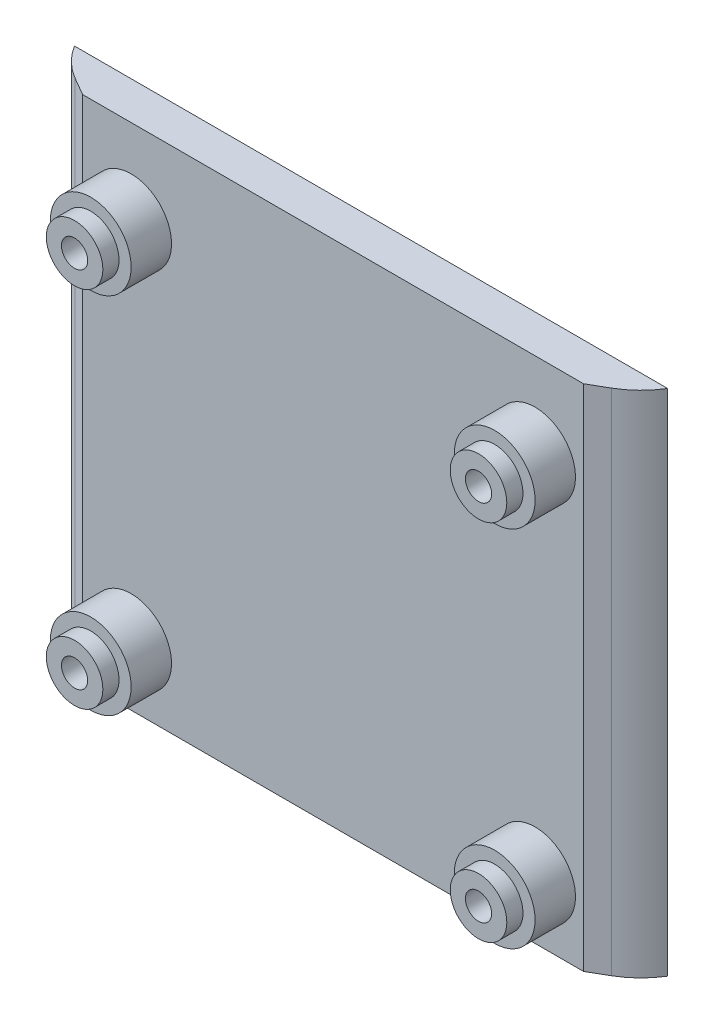
ISO-10303-21;
HEADER;
FILE_DESCRIPTION(('STEP AP214'),'2;1');
FILE_NAME('part.step','',(''),(''),'','','');
FILE_SCHEMA(('AUTOMOTIVE_DESIGN { 1 0 10303 214 1 1 1 1 }'));
ENDSEC;
DATA;
#1=APPLICATION_CONTEXT('core data for automotive mechanical design processes');
#2=APPLICATION_PROTOCOL_DEFINITION('international standard','automotive_design',2000,#1);
#3=PRODUCT_CONTEXT('',#1,'mechanical');
#4=PRODUCT('Part','Part','',(#3));
#5=PRODUCT_RELATED_PRODUCT_CATEGORY('part','',(#4));
#6=PRODUCT_DEFINITION_FORMATION('','',#4);
#7=PRODUCT_DEFINITION_CONTEXT('part definition',#1,'design');
#8=PRODUCT_DEFINITION('design','',#6,#7);
#9=PRODUCT_DEFINITION_SHAPE('','',#8);
#10=(LENGTH_UNIT() NAMED_UNIT(*) SI_UNIT(.MILLI.,.METRE.));
#11=(NAMED_UNIT(*) PLANE_ANGLE_UNIT() SI_UNIT($,.RADIAN.));
#12=(NAMED_UNIT(*) SI_UNIT($,.STERADIAN.) SOLID_ANGLE_UNIT());
#13=UNCERTAINTY_MEASURE_WITH_UNIT(LENGTH_MEASURE(1.E-05),#10,'distance_accuracy_value','');
#14=(GEOMETRIC_REPRESENTATION_CONTEXT(3) GLOBAL_UNCERTAINTY_ASSIGNED_CONTEXT((#13)) GLOBAL_UNIT_ASSIGNED_CONTEXT((#10,
#11,#12)) REPRESENTATION_CONTEXT('',''));
#15=CARTESIAN_POINT('',(0.,0.,0.));
#16=DIRECTION('',(0.,0.,1.));
#17=DIRECTION('',(1.,0.,0.));
#18=AXIS2_PLACEMENT_3D('',#15,#16,#17);
#19=CARTESIAN_POINT('',(0.,0.,10.));
#20=DIRECTION('',(0.,1.,0.));
#21=DIRECTION('',(0.,0.,1.));
#22=AXIS2_PLACEMENT_3D('',#19,#20,#21);
#23=PLANE('',#22);
#24=CARTESIAN_POINT('',(2.81284282483099,0.,0.0769901783117602));
#25=DIRECTION('',(0.,1.,0.));
#26=DIRECTION('',(0.,0.,1.));
#27=AXIS2_PLACEMENT_3D('',#24,#25,#26);
#28=CIRCLE('',#27,10.);
#29=CARTESIAN_POINT('',(-2.18715717516904,0.,8.73724421615612));
#30=VERTEX_POINT('',#29);
#31=CARTESIAN_POINT('',(-5.71305020118273,0.,5.30280572317846));
#32=VERTEX_POINT('',#31);
#33=EDGE_CURVE('E113',#30,#32,#28,.F.);
#34=ORIENTED_EDGE('',*,*,#33,.T.);
#35=DIRECTION('',(1.,0.,0.));
#36=VECTOR('',#35,1.);
#37=CARTESIAN_POINT('',(82.2171151192355,0.,5.30280572317846));
#38=LINE('',#37,#36);
#39=CARTESIAN_POINT('',(67.7130502011828,0.,5.30280572317846));
#40=VERTEX_POINT('',#39);
#41=EDGE_CURVE('E88',#32,#40,#38,.T.);
#42=ORIENTED_EDGE('',*,*,#41,.T.);
#43=CARTESIAN_POINT('',(59.187157175169,0.,0.0769901783117602));
#44=DIRECTION('',(0.,1.,0.));
#45=DIRECTION('',(0.,0.,1.));
#46=AXIS2_PLACEMENT_3D('',#43,#44,#45);
#47=CIRCLE('',#46,10.);
#48=CARTESIAN_POINT('',(64.187157175169,0.,8.73724421615611));
#49=VERTEX_POINT('',#48);
#50=EDGE_CURVE('E56',#40,#49,#47,.F.);
#51=ORIENTED_EDGE('',*,*,#50,.T.);
#52=DIRECTION('',(-0.866025403784436,0.,0.500000000000004));
#53=VECTOR('',#52,1.);
#54=CARTESIAN_POINT('',(62.,0.,10.));
#55=LINE('',#54,#53);
#56=CARTESIAN_POINT('',(62.,0.,10.));
#57=VERTEX_POINT('',#56);
#58=EDGE_CURVE('E121',#49,#57,#55,.T.);
#59=ORIENTED_EDGE('',*,*,#58,.T.);
#60=DIRECTION('',(1.,0.,0.));
#61=VECTOR('',#60,1.);
#62=CARTESIAN_POINT('',(0.,0.,10.));
#63=LINE('',#62,#61);
#64=CARTESIAN_POINT('',(0.,0.,10.));
#65=VERTEX_POINT('',#64);
#66=EDGE_CURVE('E189',#65,#57,#63,.T.);
#67=ORIENTED_EDGE('',*,*,#66,.F.);
#68=DIRECTION('',(0.866025403784436,0.,0.500000000000004));
#69=VECTOR('',#68,1.);
#70=CARTESIAN_POINT('',(0.,0.,10.));
#71=LINE('',#70,#69);
#72=EDGE_CURVE('E134',#30,#65,#71,.T.);
#73=ORIENTED_EDGE('',*,*,#72,.F.);
#74=EDGE_LOOP('',(#34,#42,#51,#59,#67,#73));
#75=FACE_BOUND('',#74,.T.);
#76=ADVANCED_FACE('F34',(#75),#23,.F.);
#77=CARTESIAN_POINT('',(0.,0.,10.));
#78=DIRECTION('',(0.,0.,-1.));
#79=DIRECTION('',(-1.,0.,0.));
#80=AXIS2_PLACEMENT_3D('',#77,#78,#79);
#81=PLANE('',#80);
#82=CARTESIAN_POINT('',(6.,52.5,10.));
#83=DIRECTION('',(0.,0.,-1.));
#84=DIRECTION('',(-1.,0.,0.));
#85=AXIS2_PLACEMENT_3D('',#82,#83,#84);
#86=CIRCLE('',#85,5.);
#87=CARTESIAN_POINT('',(1.,52.5,10.));
#88=VERTEX_POINT('',#87);
#89=EDGE_CURVE('E194',#88,#88,#86,.F.);
#90=ORIENTED_EDGE('',*,*,#89,.F.);
#91=EDGE_LOOP('',(#90));
#92=FACE_BOUND('',#91,.T.);
#93=CARTESIAN_POINT('',(56.,52.5,10.));
#94=DIRECTION('',(0.,0.,-1.));
#95=DIRECTION('',(-1.,0.,0.));
#96=AXIS2_PLACEMENT_3D('',#93,#94,#95);
#97=CIRCLE('',#96,5.);
#98=CARTESIAN_POINT('',(51.,52.5,10.));
#99=VERTEX_POINT('',#98);
#100=EDGE_CURVE('E108',#99,#99,#97,.F.);
#101=ORIENTED_EDGE('',*,*,#100,.F.);
#102=EDGE_LOOP('',(#101));
#103=FACE_BOUND('',#102,.T.);
#104=DIRECTION('',(0.,-1.,0.));
#105=VECTOR('',#104,1.);
#106=CARTESIAN_POINT('',(0.,0.,10.));
#107=LINE('',#106,#105);
#108=CARTESIAN_POINT('',(0.,63.,10.));
#109=VERTEX_POINT('',#108);
#110=EDGE_CURVE('E186',#109,#65,#107,.T.);
#111=ORIENTED_EDGE('',*,*,#110,.T.);
#112=ORIENTED_EDGE('',*,*,#66,.T.);
#113=DIRECTION('',(0.,1.,0.));
#114=VECTOR('',#113,1.);
#115=CARTESIAN_POINT('',(62.,0.,10.));
#116=LINE('',#115,#114);
#117=CARTESIAN_POINT('',(62.,63.,10.));
#118=VERTEX_POINT('',#117);
#119=EDGE_CURVE('E192',#57,#118,#116,.T.);
#120=ORIENTED_EDGE('',*,*,#119,.T.);
#121=DIRECTION('',(1.,0.,0.));
#122=VECTOR('',#121,1.);
#123=CARTESIAN_POINT('',(0.,63.,10.));
#124=LINE('',#123,#122);
#125=EDGE_CURVE('E125',#109,#118,#124,.T.);
#126=ORIENTED_EDGE('',*,*,#125,.F.);
#127=EDGE_LOOP('',(#111,#112,#120,#126));
#128=FACE_BOUND('',#127,.T.);
#129=CARTESIAN_POINT('',(56.,7.5,10.));
#130=DIRECTION('',(0.,0.,-1.));
#131=DIRECTION('',(-1.,0.,0.));
#132=AXIS2_PLACEMENT_3D('',#129,#130,#131);
#133=CIRCLE('',#132,5.);
#134=CARTESIAN_POINT('',(51.,7.5,10.));
#135=VERTEX_POINT('',#134);
#136=EDGE_CURVE('E197',#135,#135,#133,.F.);
#137=ORIENTED_EDGE('',*,*,#136,.F.);
#138=EDGE_LOOP('',(#137));
#139=FACE_BOUND('',#138,.T.);
#140=CARTESIAN_POINT('',(6.,7.49999999999999,10.));
#141=DIRECTION('',(0.,0.,-1.));
#142=DIRECTION('',(-1.,0.,0.));
#143=AXIS2_PLACEMENT_3D('',#140,#141,#142);
#144=CIRCLE('',#143,5.);
#145=CARTESIAN_POINT('',(0.999999999999997,7.49999999999999,10.));
#146=VERTEX_POINT('',#145);
#147=EDGE_CURVE('E200',#146,#146,#144,.F.);
#148=ORIENTED_EDGE('',*,*,#147,.F.);
#149=EDGE_LOOP('',(#148));
#150=FACE_BOUND('',#149,.T.);
#151=ADVANCED_FACE('F207',(#92,#103,#128,#139,#150),#81,.F.);
#152=CARTESIAN_POINT('',(6.,52.5,15.));
#153=DIRECTION('',(0.,0.,-1.));
#154=DIRECTION('',(-1.,0.,0.));
#155=AXIS2_PLACEMENT_3D('',#152,#153,#154);
#156=CYLINDRICAL_SURFACE('',#155,5.);
#157=CARTESIAN_POINT('',(6.,52.5,15.));
#158=DIRECTION('',(0.,0.,1.));
#159=DIRECTION('',(1.,0.,0.));
#160=AXIS2_PLACEMENT_3D('',#157,#158,#159);
#161=CIRCLE('',#160,5.);
#162=CARTESIAN_POINT('',(11.,52.5,15.));
#163=VERTEX_POINT('',#162);
#164=EDGE_CURVE('E183',#163,#163,#161,.T.);
#165=ORIENTED_EDGE('',*,*,#164,.F.);
#166=EDGE_LOOP('',(#165));
#167=FACE_BOUND('',#166,.T.);
#168=ORIENTED_EDGE('',*,*,#89,.T.);
#169=EDGE_LOOP('',(#168));
#170=FACE_BOUND('',#169,.T.);
#171=ADVANCED_FACE('F210',(#167,#170),#156,.T.);
#172=CARTESIAN_POINT('',(6.,52.5,15.));
#173=DIRECTION('',(0.,0.,1.));
#174=DIRECTION('',(1.,0.,0.));
#175=AXIS2_PLACEMENT_3D('',#172,#173,#174);
#176=PLANE('',#175);
#177=CARTESIAN_POINT('',(6.,52.5,15.));
#178=DIRECTION('',(0.,0.,1.));
#179=DIRECTION('',(1.,0.,0.));
#180=AXIS2_PLACEMENT_3D('',#177,#178,#179);
#181=CIRCLE('',#180,3.5);
#182=CARTESIAN_POINT('',(9.5,52.5,15.));
#183=VERTEX_POINT('',#182);
#184=EDGE_CURVE('E166',#183,#183,#181,.T.);
#185=ORIENTED_EDGE('',*,*,#184,.F.);
#186=EDGE_LOOP('',(#185));
#187=FACE_BOUND('',#186,.T.);
#188=ORIENTED_EDGE('',*,*,#164,.T.);
#189=EDGE_LOOP('',(#188));
#190=FACE_BOUND('',#189,.T.);
#191=ADVANCED_FACE('F446',(#187,#190),#176,.T.);
#192=CARTESIAN_POINT('',(56.,7.5,15.));
#193=DIRECTION('',(0.,0.,-1.));
#194=DIRECTION('',(-1.,0.,0.));
#195=AXIS2_PLACEMENT_3D('',#192,#193,#194);
#196=CYLINDRICAL_SURFACE('',#195,5.);
#197=CARTESIAN_POINT('',(56.,7.5,15.));
#198=DIRECTION('',(0.,0.,1.));
#199=DIRECTION('',(1.,0.,0.));
#200=AXIS2_PLACEMENT_3D('',#197,#198,#199);
#201=CIRCLE('',#200,5.);
#202=CARTESIAN_POINT('',(61.,7.5,15.));
#203=VERTEX_POINT('',#202);
#204=EDGE_CURVE('E180',#203,#203,#201,.T.);
#205=ORIENTED_EDGE('',*,*,#204,.F.);
#206=EDGE_LOOP('',(#205));
#207=FACE_BOUND('',#206,.T.);
#208=ORIENTED_EDGE('',*,*,#136,.T.);
#209=EDGE_LOOP('',(#208));
#210=FACE_BOUND('',#209,.T.);
#211=ADVANCED_FACE('F232',(#207,#210),#196,.T.);
#212=CARTESIAN_POINT('',(56.,7.5,15.));
#213=DIRECTION('',(0.,0.,1.));
#214=DIRECTION('',(1.,0.,0.));
#215=AXIS2_PLACEMENT_3D('',#212,#213,#214);
#216=PLANE('',#215);
#217=CARTESIAN_POINT('',(56.,7.5,15.));
#218=DIRECTION('',(0.,0.,1.));
#219=DIRECTION('',(1.,0.,0.));
#220=AXIS2_PLACEMENT_3D('',#217,#218,#219);
#221=CIRCLE('',#220,3.5);
#222=CARTESIAN_POINT('',(59.5,7.5,15.));
#223=VERTEX_POINT('',#222);
#224=EDGE_CURVE('E154',#223,#223,#221,.T.);
#225=ORIENTED_EDGE('',*,*,#224,.F.);
#226=EDGE_LOOP('',(#225));
#227=FACE_BOUND('',#226,.T.);
#228=ORIENTED_EDGE('',*,*,#204,.T.);
#229=EDGE_LOOP('',(#228));
#230=FACE_BOUND('',#229,.T.);
#231=ADVANCED_FACE('F223',(#227,#230),#216,.T.);
#232=CARTESIAN_POINT('',(6.,7.49999999999999,15.));
#233=DIRECTION('',(0.,0.,-1.));
#234=DIRECTION('',(-1.,0.,0.));
#235=AXIS2_PLACEMENT_3D('',#232,#233,#234);
#236=CYLINDRICAL_SURFACE('',#235,5.);
#237=CARTESIAN_POINT('',(6.,7.49999999999999,15.));
#238=DIRECTION('',(0.,0.,1.));
#239=DIRECTION('',(1.,0.,0.));
#240=AXIS2_PLACEMENT_3D('',#237,#238,#239);
#241=CIRCLE('',#240,5.);
#242=CARTESIAN_POINT('',(11.,7.49999999999999,15.));
#243=VERTEX_POINT('',#242);
#244=EDGE_CURVE('E177',#243,#243,#241,.T.);
#245=ORIENTED_EDGE('',*,*,#244,.F.);
#246=EDGE_LOOP('',(#245));
#247=FACE_BOUND('',#246,.T.);
#248=ORIENTED_EDGE('',*,*,#147,.T.);
#249=EDGE_LOOP('',(#248));
#250=FACE_BOUND('',#249,.T.);
#251=ADVANCED_FACE('F220',(#247,#250),#236,.T.);
#252=CARTESIAN_POINT('',(6.,7.49999999999999,15.));
#253=DIRECTION('',(0.,0.,1.));
#254=DIRECTION('',(1.,0.,0.));
#255=AXIS2_PLACEMENT_3D('',#252,#253,#254);
#256=PLANE('',#255);
#257=CARTESIAN_POINT('',(6.,7.49999999999999,15.));
#258=DIRECTION('',(0.,0.,1.));
#259=DIRECTION('',(1.,0.,0.));
#260=AXIS2_PLACEMENT_3D('',#257,#258,#259);
#261=CIRCLE('',#260,3.5);
#262=CARTESIAN_POINT('',(9.5,7.49999999999999,15.));
#263=VERTEX_POINT('',#262);
#264=EDGE_CURVE('E150',#263,#263,#261,.T.);
#265=ORIENTED_EDGE('',*,*,#264,.F.);
#266=EDGE_LOOP('',(#265));
#267=FACE_BOUND('',#266,.T.);
#268=ORIENTED_EDGE('',*,*,#244,.T.);
#269=EDGE_LOOP('',(#268));
#270=FACE_BOUND('',#269,.T.);
#271=ADVANCED_FACE('F222',(#267,#270),#256,.T.);
#272=CARTESIAN_POINT('',(56.,52.5,15.));
#273=DIRECTION('',(0.,0.,-1.));
#274=DIRECTION('',(-1.,0.,0.));
#275=AXIS2_PLACEMENT_3D('',#272,#273,#274);
#276=CYLINDRICAL_SURFACE('',#275,5.);
#277=CARTESIAN_POINT('',(56.,52.5,15.));
#278=DIRECTION('',(0.,0.,1.));
#279=DIRECTION('',(1.,0.,0.));
#280=AXIS2_PLACEMENT_3D('',#277,#278,#279);
#281=CIRCLE('',#280,5.);
#282=CARTESIAN_POINT('',(61.,52.5,15.));
#283=VERTEX_POINT('',#282);
#284=EDGE_CURVE('E172',#283,#283,#281,.T.);
#285=ORIENTED_EDGE('',*,*,#284,.F.);
#286=EDGE_LOOP('',(#285));
#287=FACE_BOUND('',#286,.T.);
#288=ORIENTED_EDGE('',*,*,#100,.T.);
#289=EDGE_LOOP('',(#288));
#290=FACE_BOUND('',#289,.T.);
#291=ADVANCED_FACE('F205',(#287,#290),#276,.T.);
#292=CARTESIAN_POINT('',(56.,52.5,15.));
#293=DIRECTION('',(0.,0.,1.));
#294=DIRECTION('',(1.,0.,0.));
#295=AXIS2_PLACEMENT_3D('',#292,#293,#294);
#296=PLANE('',#295);
#297=CARTESIAN_POINT('',(56.,52.5,15.));
#298=DIRECTION('',(0.,0.,1.));
#299=DIRECTION('',(1.,0.,0.));
#300=AXIS2_PLACEMENT_3D('',#297,#298,#299);
#301=CIRCLE('',#300,3.5);
#302=CARTESIAN_POINT('',(59.5,52.5,15.));
#303=VERTEX_POINT('',#302);
#304=EDGE_CURVE('E160',#303,#303,#301,.T.);
#305=ORIENTED_EDGE('',*,*,#304,.F.);
#306=EDGE_LOOP('',(#305));
#307=FACE_BOUND('',#306,.T.);
#308=ORIENTED_EDGE('',*,*,#284,.T.);
#309=EDGE_LOOP('',(#308));
#310=FACE_BOUND('',#309,.T.);
#311=ADVANCED_FACE('F304',(#307,#310),#296,.T.);
#312=CARTESIAN_POINT('',(6.,52.5,17.));
#313=DIRECTION('',(0.,0.,-1.));
#314=DIRECTION('',(-1.,0.,0.));
#315=AXIS2_PLACEMENT_3D('',#312,#313,#314);
#316=CYLINDRICAL_SURFACE('',#315,3.5);
#317=CARTESIAN_POINT('',(6.,52.5,17.));
#318=DIRECTION('',(0.,0.,1.));
#319=DIRECTION('',(1.,0.,0.));
#320=AXIS2_PLACEMENT_3D('',#317,#318,#319);
#321=CIRCLE('',#320,3.5);
#322=CARTESIAN_POINT('',(9.5,52.5,17.));
#323=VERTEX_POINT('',#322);
#324=EDGE_CURVE('E169',#323,#323,#321,.T.);
#325=ORIENTED_EDGE('',*,*,#324,.F.);
#326=EDGE_LOOP('',(#325));
#327=FACE_BOUND('',#326,.T.);
#328=ORIENTED_EDGE('',*,*,#184,.T.);
#329=EDGE_LOOP('',(#328));
#330=FACE_BOUND('',#329,.T.);
#331=ADVANCED_FACE('F300',(#327,#330),#316,.T.);
#332=CARTESIAN_POINT('',(6.,52.5,17.));
#333=DIRECTION('',(0.,0.,1.));
#334=DIRECTION('',(1.,0.,0.));
#335=AXIS2_PLACEMENT_3D('',#332,#333,#334);
#336=PLANE('',#335);
#337=CARTESIAN_POINT('',(6.,52.5,17.));
#338=DIRECTION('',(0.,0.,1.));
#339=DIRECTION('',(1.,0.,0.));
#340=AXIS2_PLACEMENT_3D('',#337,#338,#339);
#341=CIRCLE('',#340,1.625);
#342=CARTESIAN_POINT('',(7.625,52.5,17.));
#343=VERTEX_POINT('',#342);
#344=EDGE_CURVE('E142',#343,#343,#341,.T.);
#345=ORIENTED_EDGE('',*,*,#344,.F.);
#346=EDGE_LOOP('',(#345));
#347=FACE_BOUND('',#346,.T.);
#348=ORIENTED_EDGE('',*,*,#324,.T.);
#349=EDGE_LOOP('',(#348));
#350=FACE_BOUND('',#349,.T.);
#351=ADVANCED_FACE('F296',(#347,#350),#336,.T.);
#352=CARTESIAN_POINT('',(56.,52.5,17.));
#353=DIRECTION('',(0.,0.,-1.));
#354=DIRECTION('',(-1.,0.,0.));
#355=AXIS2_PLACEMENT_3D('',#352,#353,#354);
#356=CYLINDRICAL_SURFACE('',#355,3.5);
#357=CARTESIAN_POINT('',(56.,52.5,17.));
#358=DIRECTION('',(0.,0.,1.));
#359=DIRECTION('',(1.,0.,0.));
#360=AXIS2_PLACEMENT_3D('',#357,#358,#359);
#361=CIRCLE('',#360,3.5);
#362=CARTESIAN_POINT('',(59.5,52.5,17.));
#363=VERTEX_POINT('',#362);
#364=EDGE_CURVE('E163',#363,#363,#361,.T.);
#365=ORIENTED_EDGE('',*,*,#364,.F.);
#366=EDGE_LOOP('',(#365));
#367=FACE_BOUND('',#366,.T.);
#368=ORIENTED_EDGE('',*,*,#304,.T.);
#369=EDGE_LOOP('',(#368));
#370=FACE_BOUND('',#369,.T.);
#371=ADVANCED_FACE('F292',(#367,#370),#356,.T.);
#372=CARTESIAN_POINT('',(56.,52.5,17.));
#373=DIRECTION('',(0.,0.,1.));
#374=DIRECTION('',(1.,0.,0.));
#375=AXIS2_PLACEMENT_3D('',#372,#373,#374);
#376=PLANE('',#375);
#377=CARTESIAN_POINT('',(56.,52.5,17.));
#378=DIRECTION('',(0.,0.,1.));
#379=DIRECTION('',(1.,0.,0.));
#380=AXIS2_PLACEMENT_3D('',#377,#378,#379);
#381=CIRCLE('',#380,1.625);
#382=CARTESIAN_POINT('',(57.625,52.5,17.));
#383=VERTEX_POINT('',#382);
#384=EDGE_CURVE('E139',#383,#383,#381,.T.);
#385=ORIENTED_EDGE('',*,*,#384,.F.);
#386=EDGE_LOOP('',(#385));
#387=FACE_BOUND('',#386,.T.);
#388=ORIENTED_EDGE('',*,*,#364,.T.);
#389=EDGE_LOOP('',(#388));
#390=FACE_BOUND('',#389,.T.);
#391=ADVANCED_FACE('F288',(#387,#390),#376,.T.);
#392=CARTESIAN_POINT('',(56.,7.5,17.));
#393=DIRECTION('',(0.,0.,-1.));
#394=DIRECTION('',(-1.,0.,0.));
#395=AXIS2_PLACEMENT_3D('',#392,#393,#394);
#396=CYLINDRICAL_SURFACE('',#395,3.5);
#397=CARTESIAN_POINT('',(56.,7.5,17.));
#398=DIRECTION('',(0.,0.,1.));
#399=DIRECTION('',(1.,0.,0.));
#400=AXIS2_PLACEMENT_3D('',#397,#398,#399);
#401=CIRCLE('',#400,3.5);
#402=CARTESIAN_POINT('',(59.5,7.5,17.));
#403=VERTEX_POINT('',#402);
#404=EDGE_CURVE('E157',#403,#403,#401,.T.);
#405=ORIENTED_EDGE('',*,*,#404,.F.);
#406=EDGE_LOOP('',(#405));
#407=FACE_BOUND('',#406,.T.);
#408=ORIENTED_EDGE('',*,*,#224,.T.);
#409=EDGE_LOOP('',(#408));
#410=FACE_BOUND('',#409,.T.);
#411=ADVANCED_FACE('F284',(#407,#410),#396,.T.);
#412=CARTESIAN_POINT('',(56.,7.5,17.));
#413=DIRECTION('',(0.,0.,1.));
#414=DIRECTION('',(1.,0.,0.));
#415=AXIS2_PLACEMENT_3D('',#412,#413,#414);
#416=PLANE('',#415);
#417=CARTESIAN_POINT('',(56.,7.5,17.));
#418=DIRECTION('',(0.,0.,1.));
#419=DIRECTION('',(1.,0.,0.));
#420=AXIS2_PLACEMENT_3D('',#417,#418,#419);
#421=CIRCLE('',#420,1.625);
#422=CARTESIAN_POINT('',(57.625,7.5,17.));
#423=VERTEX_POINT('',#422);
#424=EDGE_CURVE('E143',#423,#423,#421,.T.);
#425=ORIENTED_EDGE('',*,*,#424,.F.);
#426=EDGE_LOOP('',(#425));
#427=FACE_BOUND('',#426,.T.);
#428=ORIENTED_EDGE('',*,*,#404,.T.);
#429=EDGE_LOOP('',(#428));
#430=FACE_BOUND('',#429,.T.);
#431=ADVANCED_FACE('F280',(#427,#430),#416,.T.);
#432=CARTESIAN_POINT('',(6.,7.49999999999999,17.));
#433=DIRECTION('',(0.,0.,-1.));
#434=DIRECTION('',(-1.,0.,0.));
#435=AXIS2_PLACEMENT_3D('',#432,#433,#434);
#436=CYLINDRICAL_SURFACE('',#435,3.5);
#437=CARTESIAN_POINT('',(6.,7.49999999999999,17.));
#438=DIRECTION('',(0.,0.,1.));
#439=DIRECTION('',(1.,0.,0.));
#440=AXIS2_PLACEMENT_3D('',#437,#438,#439);
#441=CIRCLE('',#440,3.5);
#442=CARTESIAN_POINT('',(9.5,7.49999999999999,17.));
#443=VERTEX_POINT('',#442);
#444=EDGE_CURVE('E151',#443,#443,#441,.T.);
#445=ORIENTED_EDGE('',*,*,#444,.F.);
#446=EDGE_LOOP('',(#445));
#447=FACE_BOUND('',#446,.T.);
#448=ORIENTED_EDGE('',*,*,#264,.T.);
#449=EDGE_LOOP('',(#448));
#450=FACE_BOUND('',#449,.T.);
#451=ADVANCED_FACE('F276',(#447,#450),#436,.T.);
#452=CARTESIAN_POINT('',(6.,7.49999999999999,17.));
#453=DIRECTION('',(0.,0.,1.));
#454=DIRECTION('',(1.,0.,0.));
#455=AXIS2_PLACEMENT_3D('',#452,#453,#454);
#456=PLANE('',#455);
#457=CARTESIAN_POINT('',(6.,7.49999999999999,17.));
#458=DIRECTION('',(0.,0.,1.));
#459=DIRECTION('',(1.,0.,0.));
#460=AXIS2_PLACEMENT_3D('',#457,#458,#459);
#461=CIRCLE('',#460,1.625);
#462=CARTESIAN_POINT('',(7.625,7.49999999999999,17.));
#463=VERTEX_POINT('',#462);
#464=EDGE_CURVE('E138',#463,#463,#461,.T.);
#465=ORIENTED_EDGE('',*,*,#464,.F.);
#466=EDGE_LOOP('',(#465));
#467=FACE_BOUND('',#466,.T.);
#468=ORIENTED_EDGE('',*,*,#444,.T.);
#469=EDGE_LOOP('',(#468));
#470=FACE_BOUND('',#469,.T.);
#471=ADVANCED_FACE('F272',(#467,#470),#456,.T.);
#472=CARTESIAN_POINT('',(6.,52.5,0.));
#473=DIRECTION('',(0.,0.,1.));
#474=DIRECTION('',(1.,0.,0.));
#475=AXIS2_PLACEMENT_3D('',#472,#473,#474);
#476=CYLINDRICAL_SURFACE('',#475,1.625);
#477=CARTESIAN_POINT('',(6.,52.5,5.30280572317846));
#478=DIRECTION('',(0.,0.,1.));
#479=DIRECTION('',(1.,0.,0.));
#480=AXIS2_PLACEMENT_3D('',#477,#478,#479);
#481=CIRCLE('',#480,1.625);
#482=CARTESIAN_POINT('',(7.625,52.5,5.30280572317846));
#483=VERTEX_POINT('',#482);
#484=EDGE_CURVE('E126',#483,#483,#481,.F.);
#485=ORIENTED_EDGE('',*,*,#484,.T.);
#486=EDGE_LOOP('',(#485));
#487=FACE_BOUND('',#486,.T.);
#488=ORIENTED_EDGE('',*,*,#344,.T.);
#489=EDGE_LOOP('',(#488));
#490=FACE_BOUND('',#489,.T.);
#491=ADVANCED_FACE('F268',(#487,#490),#476,.F.);
#492=CARTESIAN_POINT('',(6.,7.49999999999999,0.));
#493=DIRECTION('',(0.,0.,1.));
#494=DIRECTION('',(1.,0.,0.));
#495=AXIS2_PLACEMENT_3D('',#492,#493,#494);
#496=CYLINDRICAL_SURFACE('',#495,1.625);
#497=CARTESIAN_POINT('',(6.,7.49999999999999,5.30280572317846));
#498=DIRECTION('',(0.,0.,1.));
#499=DIRECTION('',(1.,0.,0.));
#500=AXIS2_PLACEMENT_3D('',#497,#498,#499);
#501=CIRCLE('',#500,1.625);
#502=CARTESIAN_POINT('',(7.625,7.49999999999999,5.30280572317846));
#503=VERTEX_POINT('',#502);
#504=EDGE_CURVE('E131',#503,#503,#501,.F.);
#505=ORIENTED_EDGE('',*,*,#504,.T.);
#506=EDGE_LOOP('',(#505));
#507=FACE_BOUND('',#506,.T.);
#508=ORIENTED_EDGE('',*,*,#464,.T.);
#509=EDGE_LOOP('',(#508));
#510=FACE_BOUND('',#509,.T.);
#511=ADVANCED_FACE('F264',(#507,#510),#496,.F.);
#512=CARTESIAN_POINT('',(56.,7.5,0.));
#513=DIRECTION('',(0.,0.,1.));
#514=DIRECTION('',(1.,0.,0.));
#515=AXIS2_PLACEMENT_3D('',#512,#513,#514);
#516=CYLINDRICAL_SURFACE('',#515,1.625);
#517=CARTESIAN_POINT('',(56.,7.5,5.30280572317846));
#518=DIRECTION('',(0.,0.,1.));
#519=DIRECTION('',(1.,0.,0.));
#520=AXIS2_PLACEMENT_3D('',#517,#518,#519);
#521=CIRCLE('',#520,1.625);
#522=CARTESIAN_POINT('',(57.625,7.5,5.30280572317846));
#523=VERTEX_POINT('',#522);
#524=EDGE_CURVE('E421',#523,#523,#521,.F.);
#525=ORIENTED_EDGE('',*,*,#524,.T.);
#526=EDGE_LOOP('',(#525));
#527=FACE_BOUND('',#526,.T.);
#528=ORIENTED_EDGE('',*,*,#424,.T.);
#529=EDGE_LOOP('',(#528));
#530=FACE_BOUND('',#529,.T.);
#531=ADVANCED_FACE('F260',(#527,#530),#516,.F.);
#532=CARTESIAN_POINT('',(56.,52.5,0.));
#533=DIRECTION('',(0.,0.,1.));
#534=DIRECTION('',(1.,0.,0.));
#535=AXIS2_PLACEMENT_3D('',#532,#533,#534);
#536=CYLINDRICAL_SURFACE('',#535,1.625);
#537=CARTESIAN_POINT('',(56.,52.5,5.30280572317846));
#538=DIRECTION('',(0.,0.,1.));
#539=DIRECTION('',(1.,0.,0.));
#540=AXIS2_PLACEMENT_3D('',#537,#538,#539);
#541=CIRCLE('',#540,1.625);
#542=CARTESIAN_POINT('',(57.625,52.5,5.30280572317846));
#543=VERTEX_POINT('',#542);
#544=EDGE_CURVE('E93',#543,#543,#541,.F.);
#545=ORIENTED_EDGE('',*,*,#544,.T.);
#546=EDGE_LOOP('',(#545));
#547=FACE_BOUND('',#546,.T.);
#548=ORIENTED_EDGE('',*,*,#384,.T.);
#549=EDGE_LOOP('',(#548));
#550=FACE_BOUND('',#549,.T.);
#551=ADVANCED_FACE('F257',(#547,#550),#536,.F.);
#552=CARTESIAN_POINT('',(-67.5663196764863,63.,-10.6098447439428));
#553=DIRECTION('',(0.,1.,0.));
#554=DIRECTION('',(0.,0.,1.));
#555=AXIS2_PLACEMENT_3D('',#552,#553,#554);
#556=PLANE('',#555);
#557=DIRECTION('',(1.,0.,0.));
#558=VECTOR('',#557,1.);
#559=CARTESIAN_POINT('',(82.2171151192355,63.,5.30280572317846));
#560=LINE('',#559,#558);
#561=CARTESIAN_POINT('',(-5.71305020118273,63.,5.30280572317846));
#562=VERTEX_POINT('',#561);
#563=CARTESIAN_POINT('',(67.7130502011828,63.,5.30280572317846));
#564=VERTEX_POINT('',#563);
#565=EDGE_CURVE('E48',#562,#564,#560,.T.);
#566=ORIENTED_EDGE('',*,*,#565,.F.);
#567=CARTESIAN_POINT('',(2.81284282483099,63.,0.0769901783117602));
#568=DIRECTION('',(0.,1.,0.));
#569=DIRECTION('',(0.,0.,1.));
#570=AXIS2_PLACEMENT_3D('',#567,#568,#569);
#571=CIRCLE('',#570,10.);
#572=CARTESIAN_POINT('',(-2.18715717516904,63.,8.73724421615612));
#573=VERTEX_POINT('',#572);
#574=EDGE_CURVE('E98',#562,#573,#571,.T.);
#575=ORIENTED_EDGE('',*,*,#574,.T.);
#576=DIRECTION('',(0.866025403784436,0.,0.500000000000004));
#577=VECTOR('',#576,1.);
#578=CARTESIAN_POINT('',(0.,63.,10.));
#579=LINE('',#578,#577);
#580=EDGE_CURVE('E128',#573,#109,#579,.T.);
#581=ORIENTED_EDGE('',*,*,#580,.T.);
#582=ORIENTED_EDGE('',*,*,#125,.T.);
#583=DIRECTION('',(-0.866025403784436,0.,0.500000000000004));
#584=VECTOR('',#583,1.);
#585=CARTESIAN_POINT('',(62.,63.,10.));
#586=LINE('',#585,#584);
#587=CARTESIAN_POINT('',(64.187157175169,63.,8.73724421615611));
#588=VERTEX_POINT('',#587);
#589=EDGE_CURVE('E119',#588,#118,#586,.T.);
#590=ORIENTED_EDGE('',*,*,#589,.F.);
#591=CARTESIAN_POINT('',(59.187157175169,63.,0.0769901783117602));
#592=DIRECTION('',(0.,1.,0.));
#593=DIRECTION('',(0.,0.,1.));
#594=AXIS2_PLACEMENT_3D('',#591,#592,#593);
#595=CIRCLE('',#594,10.);
#596=EDGE_CURVE('E101',#588,#564,#595,.T.);
#597=ORIENTED_EDGE('',*,*,#596,.T.);
#598=EDGE_LOOP('',(#566,#575,#581,#582,#590,#597));
#599=FACE_BOUND('',#598,.T.);
#600=ADVANCED_FACE('F97',(#599),#556,.T.);
#601=CARTESIAN_POINT('',(0.,0.,10.));
#602=DIRECTION('',(-0.500000000000004,0.,0.866025403784436));
#603=DIRECTION('',(0.866025403784436,0.,0.500000000000004));
#604=AXIS2_PLACEMENT_3D('',#601,#602,#603);
#605=PLANE('',#604);
#606=ORIENTED_EDGE('',*,*,#580,.F.);
#607=DIRECTION('',(0.,1.,0.));
#608=VECTOR('',#607,1.);
#609=CARTESIAN_POINT('',(-2.18715717516904,0.,8.73724421615612));
#610=LINE('',#609,#608);
#611=EDGE_CURVE('E105',#573,#30,#610,.F.);
#612=ORIENTED_EDGE('',*,*,#611,.T.);
#613=ORIENTED_EDGE('',*,*,#72,.T.);
#614=ORIENTED_EDGE('',*,*,#110,.F.);
#615=EDGE_LOOP('',(#606,#612,#613,#614));
#616=FACE_BOUND('',#615,.T.);
#617=ADVANCED_FACE('F246',(#616),#605,.T.);
#618=CARTESIAN_POINT('',(62.,0.,10.));
#619=DIRECTION('',(-0.500000000000004,0.,-0.866025403784436));
#620=DIRECTION('',(-0.866025403784436,0.,0.500000000000004));
#621=AXIS2_PLACEMENT_3D('',#618,#619,#620);
#622=PLANE('',#621);
#623=ORIENTED_EDGE('',*,*,#58,.F.);
#624=DIRECTION('',(0.,1.,0.));
#625=VECTOR('',#624,1.);
#626=CARTESIAN_POINT('',(64.187157175169,0.,8.73724421615611));
#627=LINE('',#626,#625);
#628=EDGE_CURVE('E42',#49,#588,#627,.T.);
#629=ORIENTED_EDGE('',*,*,#628,.T.);
#630=ORIENTED_EDGE('',*,*,#589,.T.);
#631=ORIENTED_EDGE('',*,*,#119,.F.);
#632=EDGE_LOOP('',(#623,#629,#630,#631));
#633=FACE_BOUND('',#632,.T.);
#634=ADVANCED_FACE('F117',(#633),#622,.F.);
#635=CARTESIAN_POINT('',(2.81284282483099,0.,0.0769901783117602));
#636=DIRECTION('',(0.,1.,0.));
#637=DIRECTION('',(0.,0.,1.));
#638=AXIS2_PLACEMENT_3D('',#635,#636,#637);
#639=CYLINDRICAL_SURFACE('',#638,10.);
#640=DIRECTION('',(0.,1.,0.));
#641=VECTOR('',#640,1.);
#642=CARTESIAN_POINT('',(-5.71305020118274,0.,5.30280572317847));
#643=LINE('',#642,#641);
#644=EDGE_CURVE('E85',#32,#562,#643,.T.);
#645=ORIENTED_EDGE('',*,*,#644,.F.);
#646=ORIENTED_EDGE('',*,*,#33,.F.);
#647=ORIENTED_EDGE('',*,*,#611,.F.);
#648=ORIENTED_EDGE('',*,*,#574,.F.);
#649=EDGE_LOOP('',(#645,#646,#647,#648));
#650=FACE_BOUND('',#649,.T.);
#651=ADVANCED_FACE('F104',(#650),#639,.T.);
#652=CARTESIAN_POINT('',(59.187157175169,0.,0.0769901783117602));
#653=DIRECTION('',(0.,1.,0.));
#654=DIRECTION('',(0.,0.,1.));
#655=AXIS2_PLACEMENT_3D('',#652,#653,#654);
#656=CYLINDRICAL_SURFACE('',#655,10.);
#657=DIRECTION('',(0.,1.,0.));
#658=VECTOR('',#657,1.);
#659=CARTESIAN_POINT('',(67.7130502011828,0.,5.30280572317846));
#660=LINE('',#659,#658);
#661=EDGE_CURVE('E11',#564,#40,#660,.F.);
#662=ORIENTED_EDGE('',*,*,#661,.F.);
#663=ORIENTED_EDGE('',*,*,#596,.F.);
#664=ORIENTED_EDGE('',*,*,#628,.F.);
#665=ORIENTED_EDGE('',*,*,#50,.F.);
#666=EDGE_LOOP('',(#662,#663,#664,#665));
#667=FACE_BOUND('',#666,.T.);
#668=ADVANCED_FACE('F36',(#667),#656,.T.);
#669=CARTESIAN_POINT('',(82.2171151192355,0.,5.30280572317846));
#670=DIRECTION('',(0.,0.,1.));
#671=DIRECTION('',(1.,0.,0.));
#672=AXIS2_PLACEMENT_3D('',#669,#670,#671);
#673=PLANE('',#672);
#674=ORIENTED_EDGE('',*,*,#504,.F.);
#675=EDGE_LOOP('',(#674));
#676=FACE_BOUND('',#675,.T.);
#677=ORIENTED_EDGE('',*,*,#544,.F.);
#678=EDGE_LOOP('',(#677));
#679=FACE_BOUND('',#678,.T.);
#680=ORIENTED_EDGE('',*,*,#644,.T.);
#681=ORIENTED_EDGE('',*,*,#565,.T.);
#682=ORIENTED_EDGE('',*,*,#661,.T.);
#683=ORIENTED_EDGE('',*,*,#41,.F.);
#684=EDGE_LOOP('',(#680,#681,#682,#683));
#685=FACE_BOUND('',#684,.T.);
#686=ORIENTED_EDGE('',*,*,#524,.F.);
#687=EDGE_LOOP('',(#686));
#688=FACE_BOUND('',#687,.T.);
#689=ORIENTED_EDGE('',*,*,#484,.F.);
#690=EDGE_LOOP('',(#689));
#691=FACE_BOUND('',#690,.T.);
#692=ADVANCED_FACE('F86',(#676,#679,#685,#688,#691),#673,.F.);
#693=CLOSED_SHELL('',(#76,#151,#171,#191,#211,#231,#251,#271,#291,#311,#331,#351,#371,#391,#411,
#431,#451,#471,#491,#511,#531,#551,#600,#617,#634,#651,#668,#692));
#694=MANIFOLD_SOLID_BREP('B2',#693);
#695=ADVANCED_BREP_SHAPE_REPRESENTATION('',(#18,#694),#14);
#696=SHAPE_DEFINITION_REPRESENTATION(#9,#695);
ENDSEC;
END-ISO-10303-21;
